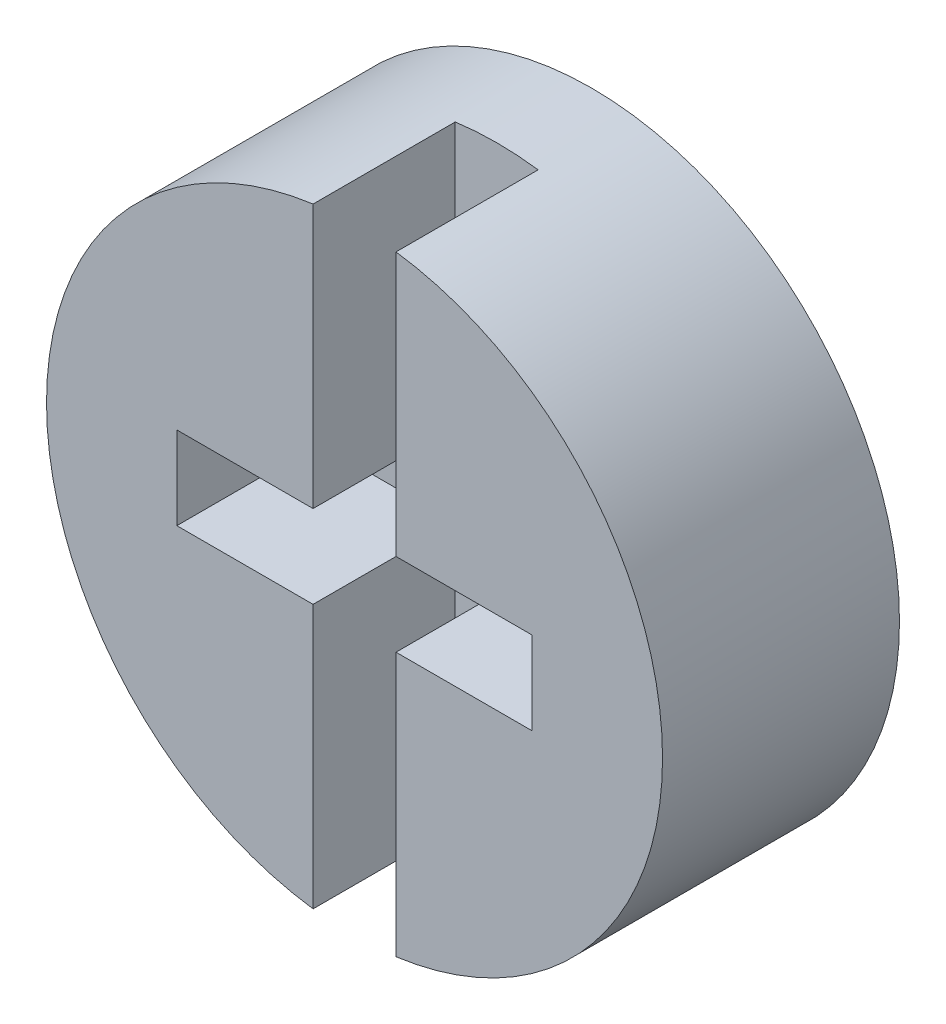
ISO-10303-21;
HEADER;
FILE_DESCRIPTION(('STEP AP214'),'2;1');
FILE_NAME('part.step','',(''),(''),'','','');
FILE_SCHEMA(('AUTOMOTIVE_DESIGN { 1 0 10303 214 1 1 1 1 }'));
ENDSEC;
DATA;
#1=APPLICATION_CONTEXT('core data for automotive mechanical design processes');
#2=APPLICATION_PROTOCOL_DEFINITION('international standard','automotive_design',2000,#1);
#3=PRODUCT_CONTEXT('',#1,'mechanical');
#4=PRODUCT('Part','Part','',(#3));
#5=PRODUCT_RELATED_PRODUCT_CATEGORY('part','',(#4));
#6=PRODUCT_DEFINITION_FORMATION('','',#4);
#7=PRODUCT_DEFINITION_CONTEXT('part definition',#1,'design');
#8=PRODUCT_DEFINITION('design','',#6,#7);
#9=PRODUCT_DEFINITION_SHAPE('','',#8);
#10=(LENGTH_UNIT() NAMED_UNIT(*) SI_UNIT(.MILLI.,.METRE.));
#11=(NAMED_UNIT(*) PLANE_ANGLE_UNIT() SI_UNIT($,.RADIAN.));
#12=(NAMED_UNIT(*) SI_UNIT($,.STERADIAN.) SOLID_ANGLE_UNIT());
#13=UNCERTAINTY_MEASURE_WITH_UNIT(LENGTH_MEASURE(1.E-05),#10,'distance_accuracy_value','');
#14=(GEOMETRIC_REPRESENTATION_CONTEXT(3) GLOBAL_UNCERTAINTY_ASSIGNED_CONTEXT((#13)) GLOBAL_UNIT_ASSIGNED_CONTEXT((#10,
#11,#12)) REPRESENTATION_CONTEXT('',''));
#15=CARTESIAN_POINT('',(0.,0.,0.));
#16=DIRECTION('',(0.,0.,1.));
#17=DIRECTION('',(1.,0.,0.));
#18=AXIS2_PLACEMENT_3D('',#15,#16,#17);
#19=CARTESIAN_POINT('',(-13.8,18.8,-25.09841350948));
#20=DIRECTION('',(0.,0.,1.));
#21=DIRECTION('',(1.,0.,0.));
#22=AXIS2_PLACEMENT_3D('',#19,#20,#21);
#23=PLANE('',#22);
#24=DIRECTION('',(0.,1.,0.));
#25=VECTOR('',#24,1.);
#26=CARTESIAN_POINT('',(-13.45,19.15,-25.09841350948));
#27=LINE('',#26,#25);
#28=CARTESIAN_POINT('',(-13.45,19.15,-25.09841350948));
#29=VERTEX_POINT('',#28);
#30=CARTESIAN_POINT('',(-13.45,21.3763346055978,-25.09841350948));
#31=VERTEX_POINT('',#30);
#32=EDGE_CURVE('E169',#29,#31,#27,.T.);
#33=ORIENTED_EDGE('',*,*,#32,.T.);
#34=CARTESIAN_POINT('',(-13.8,18.8,-25.09841350948));
#35=DIRECTION('',(0.,0.,-1.));
#36=DIRECTION('',(-1.,0.,0.));
#37=AXIS2_PLACEMENT_3D('',#34,#35,#36);
#38=CIRCLE('',#37,2.6);
#39=CARTESIAN_POINT('',(-14.15,21.3763346055978,-25.09841350948));
#40=VERTEX_POINT('',#39);
#41=EDGE_CURVE('E85',#31,#40,#38,.F.);
#42=ORIENTED_EDGE('',*,*,#41,.T.);
#43=DIRECTION('',(0.,1.,0.));
#44=VECTOR('',#43,1.);
#45=CARTESIAN_POINT('',(-14.15,22.964650726676,-25.09841350948));
#46=LINE('',#45,#44);
#47=CARTESIAN_POINT('',(-14.15,19.15,-25.09841350948));
#48=VERTEX_POINT('',#47);
#49=EDGE_CURVE('E91',#40,#48,#46,.F.);
#50=ORIENTED_EDGE('',*,*,#49,.T.);
#51=DIRECTION('',(1.,0.,0.));
#52=VECTOR('',#51,1.);
#53=CARTESIAN_POINT('',(-14.15,19.15,-25.09841350948));
#54=LINE('',#53,#52);
#55=CARTESIAN_POINT('',(-15.3,19.15,-25.09841350948));
#56=VERTEX_POINT('',#55);
#57=EDGE_CURVE('E71',#48,#56,#54,.F.);
#58=ORIENTED_EDGE('',*,*,#57,.T.);
#59=DIRECTION('',(0.,1.,0.));
#60=VECTOR('',#59,1.);
#61=CARTESIAN_POINT('',(-15.3,19.15,-25.09841350948));
#62=LINE('',#61,#60);
#63=CARTESIAN_POINT('',(-15.3,18.45,-25.09841350948));
#64=VERTEX_POINT('',#63);
#65=EDGE_CURVE('E196',#56,#64,#62,.F.);
#66=ORIENTED_EDGE('',*,*,#65,.T.);
#67=DIRECTION('',(1.,0.,0.));
#68=VECTOR('',#67,1.);
#69=CARTESIAN_POINT('',(-15.3,18.45,-25.09841350948));
#70=LINE('',#69,#68);
#71=CARTESIAN_POINT('',(-14.15,18.45,-25.09841350948));
#72=VERTEX_POINT('',#71);
#73=EDGE_CURVE('E172',#64,#72,#70,.T.);
#74=ORIENTED_EDGE('',*,*,#73,.T.);
#75=DIRECTION('',(0.,1.,0.));
#76=VECTOR('',#75,1.);
#77=CARTESIAN_POINT('',(-14.15,18.45,-25.09841350948));
#78=LINE('',#77,#76);
#79=CARTESIAN_POINT('',(-14.15,16.2236653944022,-25.09841350948));
#80=VERTEX_POINT('',#79);
#81=EDGE_CURVE('E95',#72,#80,#78,.F.);
#82=ORIENTED_EDGE('',*,*,#81,.T.);
#83=CARTESIAN_POINT('',(-13.8,18.8,-25.09841350948));
#84=DIRECTION('',(0.,0.,-1.));
#85=DIRECTION('',(-1.,0.,0.));
#86=AXIS2_PLACEMENT_3D('',#83,#84,#85);
#87=CIRCLE('',#86,2.6);
#88=CARTESIAN_POINT('',(-13.45,16.2236653944022,-25.09841350948));
#89=VERTEX_POINT('',#88);
#90=EDGE_CURVE('E20',#80,#89,#87,.F.);
#91=ORIENTED_EDGE('',*,*,#90,.T.);
#92=DIRECTION('',(0.,1.,0.));
#93=VECTOR('',#92,1.);
#94=CARTESIAN_POINT('',(-13.45,15.283450539147,-25.09841350948));
#95=LINE('',#94,#93);
#96=CARTESIAN_POINT('',(-13.45,18.45,-25.09841350948));
#97=VERTEX_POINT('',#96);
#98=EDGE_CURVE('E114',#89,#97,#95,.T.);
#99=ORIENTED_EDGE('',*,*,#98,.T.);
#100=DIRECTION('',(1.,0.,0.));
#101=VECTOR('',#100,1.);
#102=CARTESIAN_POINT('',(-13.45,18.45,-25.09841350948));
#103=LINE('',#102,#101);
#104=CARTESIAN_POINT('',(-12.3,18.45,-25.09841350948));
#105=VERTEX_POINT('',#104);
#106=EDGE_CURVE('E127',#97,#105,#103,.T.);
#107=ORIENTED_EDGE('',*,*,#106,.T.);
#108=DIRECTION('',(0.,1.,0.));
#109=VECTOR('',#108,1.);
#110=CARTESIAN_POINT('',(-12.3,18.45,-25.09841350948));
#111=LINE('',#110,#109);
#112=CARTESIAN_POINT('',(-12.3,19.15,-25.09841350948));
#113=VERTEX_POINT('',#112);
#114=EDGE_CURVE('E153',#105,#113,#111,.T.);
#115=ORIENTED_EDGE('',*,*,#114,.T.);
#116=DIRECTION('',(1.,0.,0.));
#117=VECTOR('',#116,1.);
#118=CARTESIAN_POINT('',(-12.3,19.15,-25.09841350948));
#119=LINE('',#118,#117);
#120=EDGE_CURVE('E164',#113,#29,#119,.F.);
#121=ORIENTED_EDGE('',*,*,#120,.T.);
#122=EDGE_LOOP('',(#33,#42,#50,#58,#66,#74,#82,#91,#99,#107,#115,#121));
#123=FACE_BOUND('',#122,.T.);
#124=ADVANCED_FACE('F17',(#123),#23,.T.);
#125=CARTESIAN_POINT('',(-14.15,19.15,-23.89841350948));
#126=DIRECTION('',(0.,1.,0.));
#127=DIRECTION('',(0.,0.,1.));
#128=AXIS2_PLACEMENT_3D('',#125,#126,#127);
#129=PLANE('',#128);
#130=ORIENTED_EDGE('',*,*,#57,.F.);
#131=DIRECTION('',(0.,0.,1.));
#132=VECTOR('',#131,1.);
#133=CARTESIAN_POINT('',(-14.15,19.15,-23.89841350948));
#134=LINE('',#133,#132);
#135=CARTESIAN_POINT('',(-14.15,19.15,-23.89841350948));
#136=VERTEX_POINT('',#135);
#137=EDGE_CURVE('E76',#48,#136,#134,.T.);
#138=ORIENTED_EDGE('',*,*,#137,.T.);
#139=DIRECTION('',(1.,0.,0.));
#140=VECTOR('',#139,1.);
#141=CARTESIAN_POINT('',(-13.8,19.15,-23.89841350948));
#142=LINE('',#141,#140);
#143=CARTESIAN_POINT('',(-15.3,19.15,-23.89841350948));
#144=VERTEX_POINT('',#143);
#145=EDGE_CURVE('E134',#144,#136,#142,.T.);
#146=ORIENTED_EDGE('',*,*,#145,.F.);
#147=DIRECTION('',(0.,0.,1.));
#148=VECTOR('',#147,1.);
#149=CARTESIAN_POINT('',(-15.3,19.15,-23.89841350948));
#150=LINE('',#149,#148);
#151=EDGE_CURVE('E79',#144,#56,#150,.F.);
#152=ORIENTED_EDGE('',*,*,#151,.T.);
#153=EDGE_LOOP('',(#130,#138,#146,#152));
#154=FACE_BOUND('',#153,.T.);
#155=ADVANCED_FACE('F73',(#154),#129,.F.);
#156=CARTESIAN_POINT('',(-14.15,22.964650726676,-23.89841350948));
#157=DIRECTION('',(-1.,0.,0.));
#158=DIRECTION('',(0.,0.,1.));
#159=AXIS2_PLACEMENT_3D('',#156,#157,#158);
#160=PLANE('',#159);
#161=ORIENTED_EDGE('',*,*,#49,.F.);
#162=DIRECTION('',(0.,0.,1.));
#163=VECTOR('',#162,1.);
#164=CARTESIAN_POINT('',(-14.15,21.376334605598,-23.89841350948));
#165=LINE('',#164,#163);
#166=CARTESIAN_POINT('',(-14.15,21.3763346055978,-23.89841350948));
#167=VERTEX_POINT('',#166);
#168=EDGE_CURVE('E84',#167,#40,#165,.F.);
#169=ORIENTED_EDGE('',*,*,#168,.F.);
#170=DIRECTION('',(0.,1.,0.));
#171=VECTOR('',#170,1.);
#172=CARTESIAN_POINT('',(-14.15,18.8,-23.89841350948));
#173=LINE('',#172,#171);
#174=EDGE_CURVE('E94',#136,#167,#173,.T.);
#175=ORIENTED_EDGE('',*,*,#174,.F.);
#176=ORIENTED_EDGE('',*,*,#137,.F.);
#177=EDGE_LOOP('',(#161,#169,#175,#176));
#178=FACE_BOUND('',#177,.T.);
#179=ADVANCED_FACE('F89',(#178),#160,.F.);
#180=CARTESIAN_POINT('',(-14.15,18.45,-23.89841350948));
#181=DIRECTION('',(-1.,0.,0.));
#182=DIRECTION('',(0.,0.,1.));
#183=AXIS2_PLACEMENT_3D('',#180,#181,#182);
#184=PLANE('',#183);
#185=ORIENTED_EDGE('',*,*,#81,.F.);
#186=DIRECTION('',(0.,0.,-1.));
#187=VECTOR('',#186,1.);
#188=CARTESIAN_POINT('',(-14.15,18.45,-23.89841350948));
#189=LINE('',#188,#187);
#190=CARTESIAN_POINT('',(-14.15,18.45,-23.89841350948));
#191=VERTEX_POINT('',#190);
#192=EDGE_CURVE('E173',#72,#191,#189,.F.);
#193=ORIENTED_EDGE('',*,*,#192,.T.);
#194=DIRECTION('',(0.,1.,0.));
#195=VECTOR('',#194,1.);
#196=CARTESIAN_POINT('',(-14.15,18.8,-23.89841350948));
#197=LINE('',#196,#195);
#198=CARTESIAN_POINT('',(-14.15,16.2236653944022,-23.89841350948));
#199=VERTEX_POINT('',#198);
#200=EDGE_CURVE('E182',#199,#191,#197,.T.);
#201=ORIENTED_EDGE('',*,*,#200,.F.);
#202=DIRECTION('',(0.,0.,1.));
#203=VECTOR('',#202,1.);
#204=CARTESIAN_POINT('',(-14.15,16.223665394402,-23.89841350948));
#205=LINE('',#204,#203);
#206=EDGE_CURVE('E170',#80,#199,#205,.T.);
#207=ORIENTED_EDGE('',*,*,#206,.F.);
#208=EDGE_LOOP('',(#185,#193,#201,#207));
#209=FACE_BOUND('',#208,.T.);
#210=ADVANCED_FACE('F256',(#209),#184,.F.);
#211=CARTESIAN_POINT('',(-15.3,18.45,-23.89841350948));
#212=DIRECTION('',(0.,-1.,0.));
#213=DIRECTION('',(0.,0.,-1.));
#214=AXIS2_PLACEMENT_3D('',#211,#212,#213);
#215=PLANE('',#214);
#216=ORIENTED_EDGE('',*,*,#73,.F.);
#217=DIRECTION('',(0.,0.,1.));
#218=VECTOR('',#217,1.);
#219=CARTESIAN_POINT('',(-15.3,18.45,-23.89841350948));
#220=LINE('',#219,#218);
#221=CARTESIAN_POINT('',(-15.3,18.45,-23.89841350948));
#222=VERTEX_POINT('',#221);
#223=EDGE_CURVE('E213',#64,#222,#220,.T.);
#224=ORIENTED_EDGE('',*,*,#223,.T.);
#225=DIRECTION('',(1.,0.,0.));
#226=VECTOR('',#225,1.);
#227=CARTESIAN_POINT('',(-13.8,18.45,-23.89841350948));
#228=LINE('',#227,#226);
#229=EDGE_CURVE('E178',#191,#222,#228,.F.);
#230=ORIENTED_EDGE('',*,*,#229,.F.);
#231=ORIENTED_EDGE('',*,*,#192,.F.);
#232=EDGE_LOOP('',(#216,#224,#230,#231));
#233=FACE_BOUND('',#232,.T.);
#234=ADVANCED_FACE('F233',(#233),#215,.F.);
#235=CARTESIAN_POINT('',(-15.3,19.15,-23.89841350948));
#236=DIRECTION('',(-1.,0.,0.));
#237=DIRECTION('',(0.,0.,1.));
#238=AXIS2_PLACEMENT_3D('',#235,#236,#237);
#239=PLANE('',#238);
#240=ORIENTED_EDGE('',*,*,#65,.F.);
#241=ORIENTED_EDGE('',*,*,#151,.F.);
#242=DIRECTION('',(0.,1.,0.));
#243=VECTOR('',#242,1.);
#244=CARTESIAN_POINT('',(-15.3,18.8,-23.89841350948));
#245=LINE('',#244,#243);
#246=EDGE_CURVE('E181',#222,#144,#245,.T.);
#247=ORIENTED_EDGE('',*,*,#246,.F.);
#248=ORIENTED_EDGE('',*,*,#223,.F.);
#249=EDGE_LOOP('',(#240,#241,#247,#248));
#250=FACE_BOUND('',#249,.T.);
#251=ADVANCED_FACE('F239',(#250),#239,.F.);
#252=CARTESIAN_POINT('',(-13.45,19.15,-23.89841350948));
#253=DIRECTION('',(1.,0.,0.));
#254=DIRECTION('',(0.,0.,-1.));
#255=AXIS2_PLACEMENT_3D('',#252,#253,#254);
#256=PLANE('',#255);
#257=ORIENTED_EDGE('',*,*,#32,.F.);
#258=DIRECTION('',(0.,0.,1.));
#259=VECTOR('',#258,1.);
#260=CARTESIAN_POINT('',(-13.45,19.15,-23.89841350948));
#261=LINE('',#260,#259);
#262=CARTESIAN_POINT('',(-13.45,19.15,-23.89841350948));
#263=VERTEX_POINT('',#262);
#264=EDGE_CURVE('E161',#29,#263,#261,.T.);
#265=ORIENTED_EDGE('',*,*,#264,.T.);
#266=DIRECTION('',(0.,1.,0.));
#267=VECTOR('',#266,1.);
#268=CARTESIAN_POINT('',(-13.45,18.8,-23.89841350948));
#269=LINE('',#268,#267);
#270=CARTESIAN_POINT('',(-13.45,21.3763346055978,-23.89841350948));
#271=VERTEX_POINT('',#270);
#272=EDGE_CURVE('E158',#271,#263,#269,.F.);
#273=ORIENTED_EDGE('',*,*,#272,.F.);
#274=DIRECTION('',(0.,0.,-1.));
#275=VECTOR('',#274,1.);
#276=CARTESIAN_POINT('',(-13.45,21.376334605598,-23.89841350948));
#277=LINE('',#276,#275);
#278=EDGE_CURVE('E167',#31,#271,#277,.F.);
#279=ORIENTED_EDGE('',*,*,#278,.F.);
#280=EDGE_LOOP('',(#257,#265,#273,#279));
#281=FACE_BOUND('',#280,.T.);
#282=ADVANCED_FACE('F285',(#281),#256,.F.);
#283=CARTESIAN_POINT('',(-12.3,19.15,-23.89841350948));
#284=DIRECTION('',(0.,1.,0.));
#285=DIRECTION('',(0.,0.,1.));
#286=AXIS2_PLACEMENT_3D('',#283,#284,#285);
#287=PLANE('',#286);
#288=ORIENTED_EDGE('',*,*,#120,.F.);
#289=DIRECTION('',(0.,0.,-1.));
#290=VECTOR('',#289,1.);
#291=CARTESIAN_POINT('',(-12.3,19.15,-23.89841350948));
#292=LINE('',#291,#290);
#293=CARTESIAN_POINT('',(-12.3,19.15,-23.89841350948));
#294=VERTEX_POINT('',#293);
#295=EDGE_CURVE('E150',#113,#294,#292,.F.);
#296=ORIENTED_EDGE('',*,*,#295,.T.);
#297=DIRECTION('',(1.,0.,0.));
#298=VECTOR('',#297,1.);
#299=CARTESIAN_POINT('',(-13.8,19.15,-23.89841350948));
#300=LINE('',#299,#298);
#301=EDGE_CURVE('E147',#263,#294,#300,.T.);
#302=ORIENTED_EDGE('',*,*,#301,.F.);
#303=ORIENTED_EDGE('',*,*,#264,.F.);
#304=EDGE_LOOP('',(#288,#296,#302,#303));
#305=FACE_BOUND('',#304,.T.);
#306=ADVANCED_FACE('F288',(#305),#287,.F.);
#307=CARTESIAN_POINT('',(-12.3,18.45,-23.89841350948));
#308=DIRECTION('',(1.,0.,0.));
#309=DIRECTION('',(0.,0.,-1.));
#310=AXIS2_PLACEMENT_3D('',#307,#308,#309);
#311=PLANE('',#310);
#312=ORIENTED_EDGE('',*,*,#114,.F.);
#313=DIRECTION('',(0.,0.,-1.));
#314=VECTOR('',#313,1.);
#315=CARTESIAN_POINT('',(-12.3,18.45,-23.89841350948));
#316=LINE('',#315,#314);
#317=CARTESIAN_POINT('',(-12.3,18.45,-23.89841350948));
#318=VERTEX_POINT('',#317);
#319=EDGE_CURVE('E124',#105,#318,#316,.F.);
#320=ORIENTED_EDGE('',*,*,#319,.T.);
#321=DIRECTION('',(0.,1.,0.));
#322=VECTOR('',#321,1.);
#323=CARTESIAN_POINT('',(-12.3,18.8,-23.89841350948));
#324=LINE('',#323,#322);
#325=EDGE_CURVE('E140',#294,#318,#324,.F.);
#326=ORIENTED_EDGE('',*,*,#325,.F.);
#327=ORIENTED_EDGE('',*,*,#295,.F.);
#328=EDGE_LOOP('',(#312,#320,#326,#327));
#329=FACE_BOUND('',#328,.T.);
#330=ADVANCED_FACE('F291',(#329),#311,.F.);
#331=CARTESIAN_POINT('',(-13.45,18.45,-23.89841350948));
#332=DIRECTION('',(0.,-1.,0.));
#333=DIRECTION('',(0.,0.,-1.));
#334=AXIS2_PLACEMENT_3D('',#331,#332,#333);
#335=PLANE('',#334);
#336=ORIENTED_EDGE('',*,*,#106,.F.);
#337=DIRECTION('',(0.,0.,-1.));
#338=VECTOR('',#337,1.);
#339=CARTESIAN_POINT('',(-13.45,18.45,-23.89841350948));
#340=LINE('',#339,#338);
#341=CARTESIAN_POINT('',(-13.45,18.45,-23.89841350948));
#342=VERTEX_POINT('',#341);
#343=EDGE_CURVE('E120',#97,#342,#340,.F.);
#344=ORIENTED_EDGE('',*,*,#343,.T.);
#345=DIRECTION('',(1.,0.,0.));
#346=VECTOR('',#345,1.);
#347=CARTESIAN_POINT('',(-13.8,18.45,-23.89841350948));
#348=LINE('',#347,#346);
#349=EDGE_CURVE('E137',#318,#342,#348,.F.);
#350=ORIENTED_EDGE('',*,*,#349,.F.);
#351=ORIENTED_EDGE('',*,*,#319,.F.);
#352=EDGE_LOOP('',(#336,#344,#350,#351));
#353=FACE_BOUND('',#352,.T.);
#354=ADVANCED_FACE('F294',(#353),#335,.F.);
#355=CARTESIAN_POINT('',(-13.45,15.283450539147,-23.89841350948));
#356=DIRECTION('',(1.,0.,0.));
#357=DIRECTION('',(0.,0.,-1.));
#358=AXIS2_PLACEMENT_3D('',#355,#356,#357);
#359=PLANE('',#358);
#360=ORIENTED_EDGE('',*,*,#98,.F.);
#361=DIRECTION('',(0.,0.,-1.));
#362=VECTOR('',#361,1.);
#363=CARTESIAN_POINT('',(-13.45,16.223665394402,-23.89841350948));
#364=LINE('',#363,#362);
#365=CARTESIAN_POINT('',(-13.45,16.2236653944022,-23.89841350948));
#366=VERTEX_POINT('',#365);
#367=EDGE_CURVE('E35',#366,#89,#364,.T.);
#368=ORIENTED_EDGE('',*,*,#367,.F.);
#369=DIRECTION('',(0.,1.,0.));
#370=VECTOR('',#369,1.);
#371=CARTESIAN_POINT('',(-13.45,18.8,-23.89841350948));
#372=LINE('',#371,#370);
#373=EDGE_CURVE('E109',#342,#366,#372,.F.);
#374=ORIENTED_EDGE('',*,*,#373,.F.);
#375=ORIENTED_EDGE('',*,*,#343,.F.);
#376=EDGE_LOOP('',(#360,#368,#374,#375));
#377=FACE_BOUND('',#376,.T.);
#378=ADVANCED_FACE('F118',(#377),#359,.F.);
#379=CARTESIAN_POINT('',(-13.8,18.8,-23.89841350948));
#380=DIRECTION('',(0.,0.,1.));
#381=DIRECTION('',(1.,0.,0.));
#382=AXIS2_PLACEMENT_3D('',#379,#380,#381);
#383=PLANE('',#382);
#384=ORIENTED_EDGE('',*,*,#229,.T.);
#385=ORIENTED_EDGE('',*,*,#246,.T.);
#386=ORIENTED_EDGE('',*,*,#145,.T.);
#387=ORIENTED_EDGE('',*,*,#174,.T.);
#388=CARTESIAN_POINT('',(-13.8,18.8,-23.89841350948));
#389=DIRECTION('',(0.,0.,-1.));
#390=DIRECTION('',(-1.,0.,0.));
#391=AXIS2_PLACEMENT_3D('',#388,#389,#390);
#392=CIRCLE('',#391,2.6);
#393=EDGE_CURVE('E108',#199,#167,#392,.T.);
#394=ORIENTED_EDGE('',*,*,#393,.F.);
#395=ORIENTED_EDGE('',*,*,#200,.T.);
#396=EDGE_LOOP('',(#384,#385,#386,#387,#394,#395));
#397=FACE_BOUND('',#396,.T.);
#398=ADVANCED_FACE('F242',(#397),#383,.T.);
#399=CARTESIAN_POINT('',(-13.8,18.8,-23.89841350948));
#400=DIRECTION('',(0.,0.,1.));
#401=DIRECTION('',(1.,0.,0.));
#402=AXIS2_PLACEMENT_3D('',#399,#400,#401);
#403=PLANE('',#402);
#404=ORIENTED_EDGE('',*,*,#349,.T.);
#405=ORIENTED_EDGE('',*,*,#373,.T.);
#406=CARTESIAN_POINT('',(-13.8,18.8,-23.89841350948));
#407=DIRECTION('',(0.,0.,-1.));
#408=DIRECTION('',(-1.,0.,0.));
#409=AXIS2_PLACEMENT_3D('',#406,#407,#408);
#410=CIRCLE('',#409,2.6);
#411=EDGE_CURVE('E26',#271,#366,#410,.T.);
#412=ORIENTED_EDGE('',*,*,#411,.F.);
#413=ORIENTED_EDGE('',*,*,#272,.T.);
#414=ORIENTED_EDGE('',*,*,#301,.T.);
#415=ORIENTED_EDGE('',*,*,#325,.T.);
#416=EDGE_LOOP('',(#404,#405,#412,#413,#414,#415));
#417=FACE_BOUND('',#416,.T.);
#418=ADVANCED_FACE('F267',(#417),#403,.T.);
#419=CARTESIAN_POINT('',(-13.8,18.8,-25.89841350948));
#420=DIRECTION('',(0.,0.,-1.));
#421=DIRECTION('',(-1.,0.,0.));
#422=AXIS2_PLACEMENT_3D('',#419,#420,#421);
#423=CYLINDRICAL_SURFACE('',#422,2.6);
#424=CARTESIAN_POINT('',(-13.8,18.8,-25.89841350948));
#425=DIRECTION('',(0.,0.,-1.));
#426=DIRECTION('',(-1.,0.,0.));
#427=AXIS2_PLACEMENT_3D('',#424,#425,#426);
#428=CIRCLE('',#427,2.6);
#429=CARTESIAN_POINT('',(-16.4,18.8,-25.89841350948));
#430=VERTEX_POINT('',#429);
#431=EDGE_CURVE('E11',#430,#430,#428,.F.);
#432=ORIENTED_EDGE('',*,*,#431,.T.);
#433=EDGE_LOOP('',(#432));
#434=FACE_BOUND('',#433,.T.);
#435=ORIENTED_EDGE('',*,*,#367,.T.);
#436=ORIENTED_EDGE('',*,*,#90,.F.);
#437=ORIENTED_EDGE('',*,*,#206,.T.);
#438=ORIENTED_EDGE('',*,*,#393,.T.);
#439=ORIENTED_EDGE('',*,*,#168,.T.);
#440=ORIENTED_EDGE('',*,*,#41,.F.);
#441=ORIENTED_EDGE('',*,*,#278,.T.);
#442=ORIENTED_EDGE('',*,*,#411,.T.);
#443=EDGE_LOOP('',(#435,#436,#437,#438,#439,#440,#441,#442));
#444=FACE_BOUND('',#443,.T.);
#445=ADVANCED_FACE('F122',(#434,#444),#423,.T.);
#446=CARTESIAN_POINT('',(-13.8,18.8,-25.89841350948));
#447=DIRECTION('',(0.,0.,1.));
#448=DIRECTION('',(1.,0.,0.));
#449=AXIS2_PLACEMENT_3D('',#446,#447,#448);
#450=PLANE('',#449);
#451=ORIENTED_EDGE('',*,*,#431,.F.);
#452=EDGE_LOOP('',(#451));
#453=FACE_BOUND('',#452,.T.);
#454=ADVANCED_FACE('F304',(#453),#450,.F.);
#455=CLOSED_SHELL('',(#124,#155,#179,#210,#234,#251,#282,#306,#330,#354,#378,#398,#418,#445,#454));
#456=MANIFOLD_SOLID_BREP('B1',#455);
#457=ADVANCED_BREP_SHAPE_REPRESENTATION('',(#18,#456),#14);
#458=SHAPE_DEFINITION_REPRESENTATION(#9,#457);
ENDSEC;
END-ISO-10303-21;
